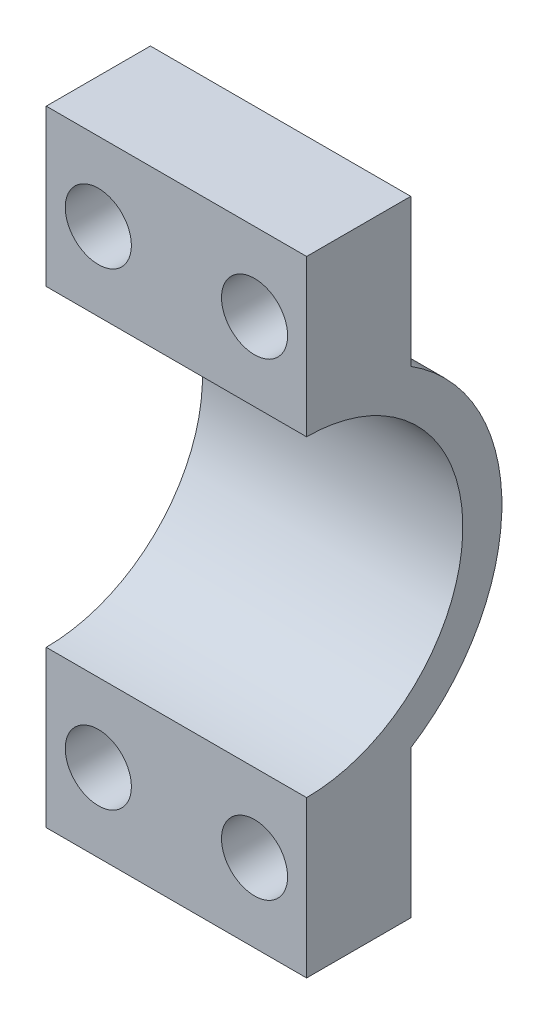
ISO-10303-21;
HEADER;
FILE_DESCRIPTION(('STEP AP214'),'2;1');
FILE_NAME('part.step','',(''),(''),'','','');
FILE_SCHEMA(('AUTOMOTIVE_DESIGN { 1 0 10303 214 1 1 1 1 }'));
ENDSEC;
DATA;
#1=APPLICATION_CONTEXT('core data for automotive mechanical design processes');
#2=APPLICATION_PROTOCOL_DEFINITION('international standard','automotive_design',2000,#1);
#3=PRODUCT_CONTEXT('',#1,'mechanical');
#4=PRODUCT('Part','Part','',(#3));
#5=PRODUCT_RELATED_PRODUCT_CATEGORY('part','',(#4));
#6=PRODUCT_DEFINITION_FORMATION('','',#4);
#7=PRODUCT_DEFINITION_CONTEXT('part definition',#1,'design');
#8=PRODUCT_DEFINITION('design','',#6,#7);
#9=PRODUCT_DEFINITION_SHAPE('','',#8);
#10=(LENGTH_UNIT() NAMED_UNIT(*) SI_UNIT(.MILLI.,.METRE.));
#11=(NAMED_UNIT(*) PLANE_ANGLE_UNIT() SI_UNIT($,.RADIAN.));
#12=(NAMED_UNIT(*) SI_UNIT($,.STERADIAN.) SOLID_ANGLE_UNIT());
#13=UNCERTAINTY_MEASURE_WITH_UNIT(LENGTH_MEASURE(1.E-05),#10,'distance_accuracy_value','');
#14=(GEOMETRIC_REPRESENTATION_CONTEXT(3) GLOBAL_UNCERTAINTY_ASSIGNED_CONTEXT((#13)) GLOBAL_UNIT_ASSIGNED_CONTEXT((#10,
#11,#12)) REPRESENTATION_CONTEXT('',''));
#15=CARTESIAN_POINT('',(0.,0.,0.));
#16=DIRECTION('',(0.,0.,1.));
#17=DIRECTION('',(1.,0.,0.));
#18=AXIS2_PLACEMENT_3D('',#15,#16,#17);
#19=CARTESIAN_POINT('',(25.,60.0000000000001,0.));
#20=DIRECTION('',(0.,0.,-1.));
#21=DIRECTION('',(0.,1.,0.));
#22=AXIS2_PLACEMENT_3D('',#19,#20,#21);
#23=PLANE('',#22);
#24=CARTESIAN_POINT('',(15.,45.,0.));
#25=DIRECTION('',(0.,0.,1.));
#26=DIRECTION('',(1.,0.,0.));
#27=AXIS2_PLACEMENT_3D('',#24,#25,#26);
#28=CIRCLE('',#27,6.35);
#29=CARTESIAN_POINT('',(21.35,45.,0.));
#30=VERTEX_POINT('',#29);
#31=EDGE_CURVE('E195',#30,#30,#28,.T.);
#32=ORIENTED_EDGE('',*,*,#31,.F.);
#33=EDGE_LOOP('',(#32));
#34=FACE_BOUND('',#33,.T.);
#35=DIRECTION('',(0.,-1.,0.));
#36=VECTOR('',#35,1.);
#37=CARTESIAN_POINT('',(-25.,60.0000000000001,0.));
#38=LINE('',#37,#36);
#39=CARTESIAN_POINT('',(-25.,60.0000000000001,0.));
#40=VERTEX_POINT('',#39);
#41=CARTESIAN_POINT('',(-25.,30.,0.));
#42=VERTEX_POINT('',#41);
#43=EDGE_CURVE('E141',#40,#42,#38,.T.);
#44=ORIENTED_EDGE('',*,*,#43,.T.);
#45=DIRECTION('',(-1.,0.,0.));
#46=VECTOR('',#45,1.);
#47=CARTESIAN_POINT('',(25.,30.,0.));
#48=LINE('',#47,#46);
#49=CARTESIAN_POINT('',(25.,30.,0.));
#50=VERTEX_POINT('',#49);
#51=EDGE_CURVE('E152',#50,#42,#48,.T.);
#52=ORIENTED_EDGE('',*,*,#51,.F.);
#53=DIRECTION('',(0.,-1.,0.));
#54=VECTOR('',#53,1.);
#55=CARTESIAN_POINT('',(25.,60.0000000000001,0.));
#56=LINE('',#55,#54);
#57=CARTESIAN_POINT('',(25.,60.0000000000001,0.));
#58=VERTEX_POINT('',#57);
#59=EDGE_CURVE('E175',#58,#50,#56,.T.);
#60=ORIENTED_EDGE('',*,*,#59,.F.);
#61=DIRECTION('',(-1.,0.,0.));
#62=VECTOR('',#61,1.);
#63=CARTESIAN_POINT('',(25.,60.0000000000001,0.));
#64=LINE('',#63,#62);
#65=EDGE_CURVE('E155',#58,#40,#64,.T.);
#66=ORIENTED_EDGE('',*,*,#65,.T.);
#67=EDGE_LOOP('',(#44,#52,#60,#66));
#68=FACE_BOUND('',#67,.T.);
#69=CARTESIAN_POINT('',(-15.,45.,0.));
#70=DIRECTION('',(0.,0.,1.));
#71=DIRECTION('',(1.,0.,0.));
#72=AXIS2_PLACEMENT_3D('',#69,#70,#71);
#73=CIRCLE('',#72,6.35);
#74=CARTESIAN_POINT('',(-8.65000000000001,45.,0.));
#75=VERTEX_POINT('',#74);
#76=EDGE_CURVE('E201',#75,#75,#73,.T.);
#77=ORIENTED_EDGE('',*,*,#76,.F.);
#78=EDGE_LOOP('',(#77));
#79=FACE_BOUND('',#78,.T.);
#80=ADVANCED_FACE('F36',(#34,#68,#79),#23,.F.);
#81=CARTESIAN_POINT('',(25.,0.,0.));
#82=DIRECTION('',(-1.,0.,0.));
#83=DIRECTION('',(0.,0.,1.));
#84=AXIS2_PLACEMENT_3D('',#81,#82,#83);
#85=CYLINDRICAL_SURFACE('',#84,37.5);
#86=CARTESIAN_POINT('',(-25.,0.,0.));
#87=DIRECTION('',(1.,0.,0.));
#88=DIRECTION('',(0.,0.,-1.));
#89=AXIS2_PLACEMENT_3D('',#86,#87,#88);
#90=CIRCLE('',#89,37.5);
#91=CARTESIAN_POINT('',(-25.,-31.7214438511239,-20.));
#92=VERTEX_POINT('',#91);
#93=CARTESIAN_POINT('',(-25.,31.7214438511238,-20.));
#94=VERTEX_POINT('',#93);
#95=EDGE_CURVE('E133',#92,#94,#90,.T.);
#96=ORIENTED_EDGE('',*,*,#95,.T.);
#97=DIRECTION('',(-1.,0.,0.));
#98=VECTOR('',#97,1.);
#99=CARTESIAN_POINT('',(25.,31.7214438511238,-20.));
#100=LINE('',#99,#98);
#101=CARTESIAN_POINT('',(25.,31.7214438511238,-20.));
#102=VERTEX_POINT('',#101);
#103=EDGE_CURVE('E11',#102,#94,#100,.T.);
#104=ORIENTED_EDGE('',*,*,#103,.F.);
#105=CARTESIAN_POINT('',(25.,0.,0.));
#106=DIRECTION('',(1.,0.,0.));
#107=DIRECTION('',(0.,0.,-1.));
#108=AXIS2_PLACEMENT_3D('',#105,#106,#107);
#109=CIRCLE('',#108,37.5);
#110=CARTESIAN_POINT('',(25.,-31.7214438511239,-20.));
#111=VERTEX_POINT('',#110);
#112=EDGE_CURVE('E148',#111,#102,#109,.T.);
#113=ORIENTED_EDGE('',*,*,#112,.F.);
#114=DIRECTION('',(-1.,0.,0.));
#115=VECTOR('',#114,1.);
#116=CARTESIAN_POINT('',(25.,-31.7214438511239,-20.));
#117=LINE('',#116,#115);
#118=EDGE_CURVE('E129',#111,#92,#117,.T.);
#119=ORIENTED_EDGE('',*,*,#118,.T.);
#120=EDGE_LOOP('',(#96,#104,#113,#119));
#121=FACE_BOUND('',#120,.T.);
#122=ADVANCED_FACE('F38',(#121),#85,.T.);
#123=CARTESIAN_POINT('',(25.,60.0000000000001,-20.));
#124=DIRECTION('',(0.,0.,1.));
#125=DIRECTION('',(0.,-1.,0.));
#126=AXIS2_PLACEMENT_3D('',#123,#124,#125);
#127=PLANE('',#126);
#128=CARTESIAN_POINT('',(-15.,45.,-20.));
#129=DIRECTION('',(0.,0.,1.));
#130=DIRECTION('',(0.,-1.,0.));
#131=AXIS2_PLACEMENT_3D('',#128,#129,#130);
#132=CIRCLE('',#131,6.35);
#133=CARTESIAN_POINT('',(-15.,38.65,-20.));
#134=VERTEX_POINT('',#133);
#135=EDGE_CURVE('E198',#134,#134,#132,.T.);
#136=ORIENTED_EDGE('',*,*,#135,.T.);
#137=EDGE_LOOP('',(#136));
#138=FACE_BOUND('',#137,.T.);
#139=CARTESIAN_POINT('',(15.,45.,-20.));
#140=DIRECTION('',(0.,0.,1.));
#141=DIRECTION('',(0.,-1.,0.));
#142=AXIS2_PLACEMENT_3D('',#139,#140,#141);
#143=CIRCLE('',#142,6.34999999999999);
#144=CARTESIAN_POINT('',(15.,38.65,-20.));
#145=VERTEX_POINT('',#144);
#146=EDGE_CURVE('E192',#145,#145,#143,.T.);
#147=ORIENTED_EDGE('',*,*,#146,.T.);
#148=EDGE_LOOP('',(#147));
#149=FACE_BOUND('',#148,.T.);
#150=DIRECTION('',(0.,1.,0.));
#151=VECTOR('',#150,1.);
#152=CARTESIAN_POINT('',(-25.,60.0000000000001,-20.));
#153=LINE('',#152,#151);
#154=CARTESIAN_POINT('',(-25.,60.0000000000001,-20.));
#155=VERTEX_POINT('',#154);
#156=EDGE_CURVE('E136',#94,#155,#153,.T.);
#157=ORIENTED_EDGE('',*,*,#156,.T.);
#158=DIRECTION('',(-1.,0.,0.));
#159=VECTOR('',#158,1.);
#160=CARTESIAN_POINT('',(25.,60.0000000000001,-20.));
#161=LINE('',#160,#159);
#162=CARTESIAN_POINT('',(25.,60.0000000000001,-20.));
#163=VERTEX_POINT('',#162);
#164=EDGE_CURVE('E45',#163,#155,#161,.T.);
#165=ORIENTED_EDGE('',*,*,#164,.F.);
#166=DIRECTION('',(0.,1.,0.));
#167=VECTOR('',#166,1.);
#168=CARTESIAN_POINT('',(25.,60.0000000000001,-20.));
#169=LINE('',#168,#167);
#170=EDGE_CURVE('E96',#102,#163,#169,.T.);
#171=ORIENTED_EDGE('',*,*,#170,.F.);
#172=ORIENTED_EDGE('',*,*,#103,.T.);
#173=EDGE_LOOP('',(#157,#165,#171,#172));
#174=FACE_BOUND('',#173,.T.);
#175=ADVANCED_FACE('F212',(#138,#149,#174),#127,.F.);
#176=CARTESIAN_POINT('',(25.,60.0000000000001,0.));
#177=DIRECTION('',(0.,-1.,0.));
#178=DIRECTION('',(0.,0.,-1.));
#179=AXIS2_PLACEMENT_3D('',#176,#177,#178);
#180=PLANE('',#179);
#181=DIRECTION('',(0.,0.,1.));
#182=VECTOR('',#181,1.);
#183=CARTESIAN_POINT('',(-25.,60.0000000000001,0.));
#184=LINE('',#183,#182);
#185=EDGE_CURVE('E139',#155,#40,#184,.T.);
#186=ORIENTED_EDGE('',*,*,#185,.T.);
#187=ORIENTED_EDGE('',*,*,#65,.F.);
#188=DIRECTION('',(0.,0.,1.));
#189=VECTOR('',#188,1.);
#190=CARTESIAN_POINT('',(25.,60.0000000000001,0.));
#191=LINE('',#190,#189);
#192=EDGE_CURVE('E163',#163,#58,#191,.T.);
#193=ORIENTED_EDGE('',*,*,#192,.F.);
#194=ORIENTED_EDGE('',*,*,#164,.T.);
#195=EDGE_LOOP('',(#186,#187,#193,#194));
#196=FACE_BOUND('',#195,.T.);
#197=ADVANCED_FACE('F161',(#196),#180,.F.);
#198=CARTESIAN_POINT('',(25.,0.,0.));
#199=DIRECTION('',(-1.,0.,0.));
#200=DIRECTION('',(0.,0.,1.));
#201=AXIS2_PLACEMENT_3D('',#198,#199,#200);
#202=CYLINDRICAL_SURFACE('',#201,30.);
#203=CARTESIAN_POINT('',(-25.,0.,0.));
#204=DIRECTION('',(-1.,0.,0.));
#205=DIRECTION('',(0.,0.,-1.));
#206=AXIS2_PLACEMENT_3D('',#203,#204,#205);
#207=CIRCLE('',#206,30.);
#208=CARTESIAN_POINT('',(-25.,-30.,0.));
#209=VERTEX_POINT('',#208);
#210=EDGE_CURVE('E143',#42,#209,#207,.T.);
#211=ORIENTED_EDGE('',*,*,#210,.T.);
#212=DIRECTION('',(-1.,0.,0.));
#213=VECTOR('',#212,1.);
#214=CARTESIAN_POINT('',(25.,-30.,0.));
#215=LINE('',#214,#213);
#216=CARTESIAN_POINT('',(25.,-30.,0.));
#217=VERTEX_POINT('',#216);
#218=EDGE_CURVE('E124',#217,#209,#215,.T.);
#219=ORIENTED_EDGE('',*,*,#218,.F.);
#220=CARTESIAN_POINT('',(25.,0.,0.));
#221=DIRECTION('',(-1.,0.,0.));
#222=DIRECTION('',(0.,0.,-1.));
#223=AXIS2_PLACEMENT_3D('',#220,#221,#222);
#224=CIRCLE('',#223,30.);
#225=EDGE_CURVE('E115',#50,#217,#224,.T.);
#226=ORIENTED_EDGE('',*,*,#225,.F.);
#227=ORIENTED_EDGE('',*,*,#51,.T.);
#228=EDGE_LOOP('',(#211,#219,#226,#227));
#229=FACE_BOUND('',#228,.T.);
#230=ADVANCED_FACE('F174',(#229),#202,.F.);
#231=CARTESIAN_POINT('',(25.,-30.0000000000001,0.));
#232=DIRECTION('',(0.,0.,-1.));
#233=DIRECTION('',(0.,1.,0.));
#234=AXIS2_PLACEMENT_3D('',#231,#232,#233);
#235=PLANE('',#234);
#236=CARTESIAN_POINT('',(15.0000000000009,-45.0000000000001,0.));
#237=DIRECTION('',(0.,0.,1.));
#238=DIRECTION('',(1.,0.,0.));
#239=AXIS2_PLACEMENT_3D('',#236,#237,#238);
#240=CIRCLE('',#239,6.35);
#241=CARTESIAN_POINT('',(21.3500000000009,-45.0000000000001,0.));
#242=VERTEX_POINT('',#241);
#243=EDGE_CURVE('E189',#242,#242,#240,.T.);
#244=ORIENTED_EDGE('',*,*,#243,.F.);
#245=EDGE_LOOP('',(#244));
#246=FACE_BOUND('',#245,.T.);
#247=CARTESIAN_POINT('',(-14.9999999999991,-45.0000000000001,0.));
#248=DIRECTION('',(0.,0.,1.));
#249=DIRECTION('',(1.,0.,0.));
#250=AXIS2_PLACEMENT_3D('',#247,#248,#249);
#251=CIRCLE('',#250,6.35);
#252=CARTESIAN_POINT('',(-8.64999999999906,-45.0000000000001,0.));
#253=VERTEX_POINT('',#252);
#254=EDGE_CURVE('E183',#253,#253,#251,.T.);
#255=ORIENTED_EDGE('',*,*,#254,.F.);
#256=EDGE_LOOP('',(#255));
#257=FACE_BOUND('',#256,.T.);
#258=DIRECTION('',(0.,-1.,0.));
#259=VECTOR('',#258,1.);
#260=CARTESIAN_POINT('',(-25.,-30.0000000000001,0.));
#261=LINE('',#260,#259);
#262=CARTESIAN_POINT('',(-25.,-60.0000000000001,0.));
#263=VERTEX_POINT('',#262);
#264=EDGE_CURVE('E123',#209,#263,#261,.T.);
#265=ORIENTED_EDGE('',*,*,#264,.T.);
#266=DIRECTION('',(-1.,0.,0.));
#267=VECTOR('',#266,1.);
#268=CARTESIAN_POINT('',(25.,-60.0000000000001,0.));
#269=LINE('',#268,#267);
#270=CARTESIAN_POINT('',(25.,-60.0000000000001,0.));
#271=VERTEX_POINT('',#270);
#272=EDGE_CURVE('E120',#271,#263,#269,.T.);
#273=ORIENTED_EDGE('',*,*,#272,.F.);
#274=DIRECTION('',(0.,-1.,0.));
#275=VECTOR('',#274,1.);
#276=CARTESIAN_POINT('',(25.,-30.0000000000001,0.));
#277=LINE('',#276,#275);
#278=EDGE_CURVE('E109',#217,#271,#277,.T.);
#279=ORIENTED_EDGE('',*,*,#278,.F.);
#280=ORIENTED_EDGE('',*,*,#218,.T.);
#281=EDGE_LOOP('',(#265,#273,#279,#280));
#282=FACE_BOUND('',#281,.T.);
#283=ADVANCED_FACE('F121',(#246,#257,#282),#235,.F.);
#284=CARTESIAN_POINT('',(25.,-60.0000000000001,0.));
#285=DIRECTION('',(0.,1.,0.));
#286=DIRECTION('',(0.,0.,1.));
#287=AXIS2_PLACEMENT_3D('',#284,#285,#286);
#288=PLANE('',#287);
#289=DIRECTION('',(0.,0.,-1.));
#290=VECTOR('',#289,1.);
#291=CARTESIAN_POINT('',(-25.,-60.0000000000001,0.));
#292=LINE('',#291,#290);
#293=CARTESIAN_POINT('',(-25.,-60.0000000000001,-20.));
#294=VERTEX_POINT('',#293);
#295=EDGE_CURVE('E82',#263,#294,#292,.T.);
#296=ORIENTED_EDGE('',*,*,#295,.T.);
#297=DIRECTION('',(-1.,0.,0.));
#298=VECTOR('',#297,1.);
#299=CARTESIAN_POINT('',(25.,-60.0000000000001,-20.));
#300=LINE('',#299,#298);
#301=CARTESIAN_POINT('',(25.,-60.0000000000001,-20.));
#302=VERTEX_POINT('',#301);
#303=EDGE_CURVE('E125',#302,#294,#300,.T.);
#304=ORIENTED_EDGE('',*,*,#303,.F.);
#305=DIRECTION('',(0.,0.,-1.));
#306=VECTOR('',#305,1.);
#307=CARTESIAN_POINT('',(25.,-60.0000000000001,0.));
#308=LINE('',#307,#306);
#309=EDGE_CURVE('E113',#271,#302,#308,.T.);
#310=ORIENTED_EDGE('',*,*,#309,.F.);
#311=ORIENTED_EDGE('',*,*,#272,.T.);
#312=EDGE_LOOP('',(#296,#304,#310,#311));
#313=FACE_BOUND('',#312,.T.);
#314=ADVANCED_FACE('F127',(#313),#288,.F.);
#315=CARTESIAN_POINT('',(25.,-31.7214438511239,-20.));
#316=DIRECTION('',(0.,0.,1.));
#317=DIRECTION('',(0.,-1.,0.));
#318=AXIS2_PLACEMENT_3D('',#315,#316,#317);
#319=PLANE('',#318);
#320=CARTESIAN_POINT('',(15.0000000000009,-45.,-20.));
#321=DIRECTION('',(0.,0.,1.));
#322=DIRECTION('',(0.,-1.,0.));
#323=AXIS2_PLACEMENT_3D('',#320,#321,#322);
#324=CIRCLE('',#323,6.34999999999999);
#325=CARTESIAN_POINT('',(15.0000000000009,-51.35,-20.));
#326=VERTEX_POINT('',#325);
#327=EDGE_CURVE('E186',#326,#326,#324,.T.);
#328=ORIENTED_EDGE('',*,*,#327,.T.);
#329=EDGE_LOOP('',(#328));
#330=FACE_BOUND('',#329,.T.);
#331=CARTESIAN_POINT('',(-14.9999999999991,-45.,-20.));
#332=DIRECTION('',(0.,0.,1.));
#333=DIRECTION('',(0.,-1.,0.));
#334=AXIS2_PLACEMENT_3D('',#331,#332,#333);
#335=CIRCLE('',#334,6.35);
#336=CARTESIAN_POINT('',(-14.9999999999991,-51.35,-20.));
#337=VERTEX_POINT('',#336);
#338=EDGE_CURVE('E137',#337,#337,#335,.T.);
#339=ORIENTED_EDGE('',*,*,#338,.T.);
#340=EDGE_LOOP('',(#339));
#341=FACE_BOUND('',#340,.T.);
#342=DIRECTION('',(0.,1.,0.));
#343=VECTOR('',#342,1.);
#344=CARTESIAN_POINT('',(-25.,-31.7214438511239,-20.));
#345=LINE('',#344,#343);
#346=EDGE_CURVE('E88',#294,#92,#345,.T.);
#347=ORIENTED_EDGE('',*,*,#346,.T.);
#348=ORIENTED_EDGE('',*,*,#118,.F.);
#349=DIRECTION('',(0.,1.,0.));
#350=VECTOR('',#349,1.);
#351=CARTESIAN_POINT('',(25.,-31.7214438511239,-20.));
#352=LINE('',#351,#350);
#353=EDGE_CURVE('E53',#302,#111,#352,.T.);
#354=ORIENTED_EDGE('',*,*,#353,.F.);
#355=ORIENTED_EDGE('',*,*,#303,.T.);
#356=EDGE_LOOP('',(#347,#348,#354,#355));
#357=FACE_BOUND('',#356,.T.);
#358=ADVANCED_FACE('F228',(#330,#341,#357),#319,.F.);
#359=CARTESIAN_POINT('',(25.,0.,0.));
#360=DIRECTION('',(1.,0.,0.));
#361=DIRECTION('',(0.,0.,-1.));
#362=AXIS2_PLACEMENT_3D('',#359,#360,#361);
#363=PLANE('',#362);
#364=ORIENTED_EDGE('',*,*,#112,.T.);
#365=ORIENTED_EDGE('',*,*,#170,.T.);
#366=ORIENTED_EDGE('',*,*,#192,.T.);
#367=ORIENTED_EDGE('',*,*,#59,.T.);
#368=ORIENTED_EDGE('',*,*,#225,.T.);
#369=ORIENTED_EDGE('',*,*,#278,.T.);
#370=ORIENTED_EDGE('',*,*,#309,.T.);
#371=ORIENTED_EDGE('',*,*,#353,.T.);
#372=EDGE_LOOP('',(#364,#365,#366,#367,#368,#369,#370,#371));
#373=FACE_BOUND('',#372,.T.);
#374=ADVANCED_FACE('F111',(#373),#363,.T.);
#375=CARTESIAN_POINT('',(-25.,0.,0.));
#376=DIRECTION('',(1.,0.,0.));
#377=DIRECTION('',(0.,0.,-1.));
#378=AXIS2_PLACEMENT_3D('',#375,#376,#377);
#379=PLANE('',#378);
#380=ORIENTED_EDGE('',*,*,#95,.F.);
#381=ORIENTED_EDGE('',*,*,#346,.F.);
#382=ORIENTED_EDGE('',*,*,#295,.F.);
#383=ORIENTED_EDGE('',*,*,#264,.F.);
#384=ORIENTED_EDGE('',*,*,#210,.F.);
#385=ORIENTED_EDGE('',*,*,#43,.F.);
#386=ORIENTED_EDGE('',*,*,#185,.F.);
#387=ORIENTED_EDGE('',*,*,#156,.F.);
#388=EDGE_LOOP('',(#380,#381,#382,#383,#384,#385,#386,#387));
#389=FACE_BOUND('',#388,.T.);
#390=ADVANCED_FACE('F167',(#389),#379,.F.);
#391=CARTESIAN_POINT('',(-14.9999999999991,-45.0000000000001,0.));
#392=DIRECTION('',(0.,0.,1.));
#393=DIRECTION('',(1.,0.,0.));
#394=AXIS2_PLACEMENT_3D('',#391,#392,#393);
#395=CYLINDRICAL_SURFACE('',#394,6.35);
#396=ORIENTED_EDGE('',*,*,#338,.F.);
#397=EDGE_LOOP('',(#396));
#398=FACE_BOUND('',#397,.T.);
#399=ORIENTED_EDGE('',*,*,#254,.T.);
#400=EDGE_LOOP('',(#399));
#401=FACE_BOUND('',#400,.T.);
#402=ADVANCED_FACE('F249',(#398,#401),#395,.F.);
#403=CARTESIAN_POINT('',(15.0000000000009,-45.0000000000001,0.));
#404=DIRECTION('',(0.,0.,1.));
#405=DIRECTION('',(1.,0.,0.));
#406=AXIS2_PLACEMENT_3D('',#403,#404,#405);
#407=CYLINDRICAL_SURFACE('',#406,6.34999999999999);
#408=ORIENTED_EDGE('',*,*,#327,.F.);
#409=EDGE_LOOP('',(#408));
#410=FACE_BOUND('',#409,.T.);
#411=ORIENTED_EDGE('',*,*,#243,.T.);
#412=EDGE_LOOP('',(#411));
#413=FACE_BOUND('',#412,.T.);
#414=ADVANCED_FACE('F251',(#410,#413),#407,.F.);
#415=CARTESIAN_POINT('',(15.,45.,0.));
#416=DIRECTION('',(0.,0.,1.));
#417=DIRECTION('',(1.,0.,0.));
#418=AXIS2_PLACEMENT_3D('',#415,#416,#417);
#419=CYLINDRICAL_SURFACE('',#418,6.34999999999999);
#420=ORIENTED_EDGE('',*,*,#146,.F.);
#421=EDGE_LOOP('',(#420));
#422=FACE_BOUND('',#421,.T.);
#423=ORIENTED_EDGE('',*,*,#31,.T.);
#424=EDGE_LOOP('',(#423));
#425=FACE_BOUND('',#424,.T.);
#426=ADVANCED_FACE('F258',(#422,#425),#419,.F.);
#427=CARTESIAN_POINT('',(-15.,45.,0.));
#428=DIRECTION('',(0.,0.,1.));
#429=DIRECTION('',(1.,0.,0.));
#430=AXIS2_PLACEMENT_3D('',#427,#428,#429);
#431=CYLINDRICAL_SURFACE('',#430,6.35);
#432=ORIENTED_EDGE('',*,*,#135,.F.);
#433=EDGE_LOOP('',(#432));
#434=FACE_BOUND('',#433,.T.);
#435=ORIENTED_EDGE('',*,*,#76,.T.);
#436=EDGE_LOOP('',(#435));
#437=FACE_BOUND('',#436,.T.);
#438=ADVANCED_FACE('F205',(#434,#437),#431,.F.);
#439=CLOSED_SHELL('',(#80,#122,#175,#197,#230,#283,#314,#358,#374,#390,#402,#414,#426,#438));
#440=MANIFOLD_SOLID_BREP('B2',#439);
#441=ADVANCED_BREP_SHAPE_REPRESENTATION('',(#18,#440),#14);
#442=SHAPE_DEFINITION_REPRESENTATION(#9,#441);
ENDSEC;
END-ISO-10303-21;
